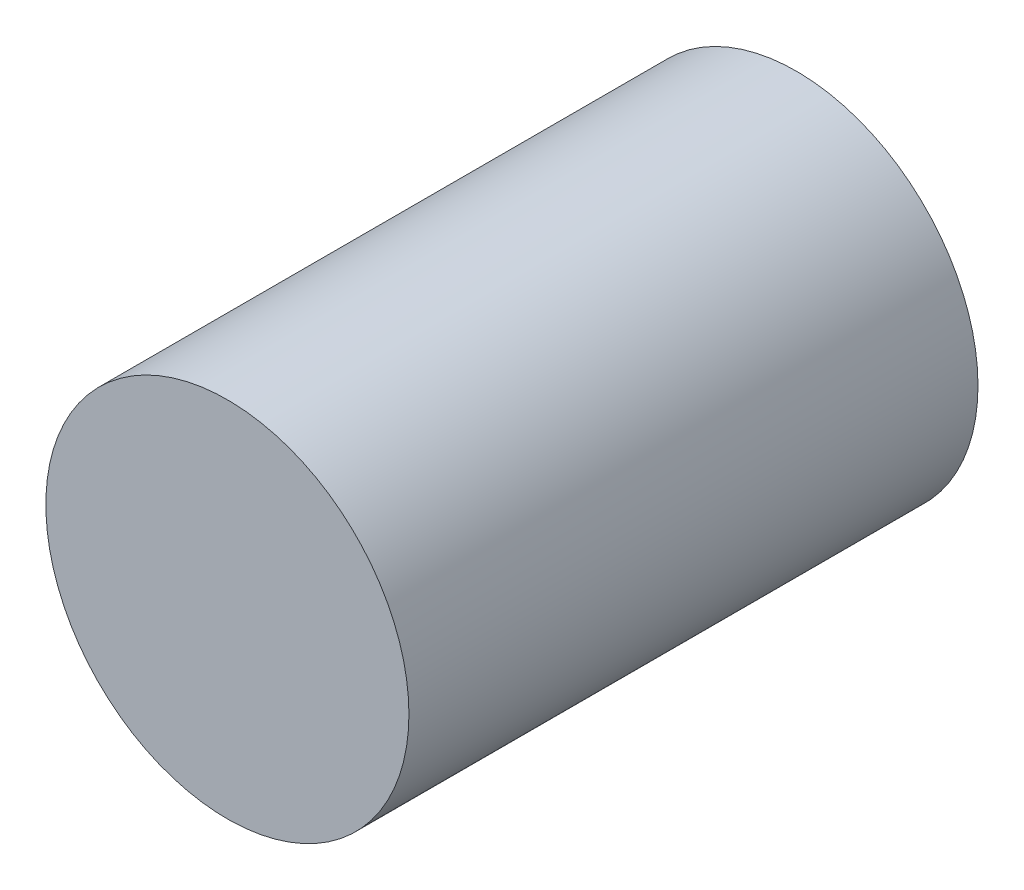
ISO-10303-21;
HEADER;
FILE_DESCRIPTION(('STEP AP214'),'2;1');
FILE_NAME('part.step','',(''),(''),'','','');
FILE_SCHEMA(('AUTOMOTIVE_DESIGN { 1 0 10303 214 1 1 1 1 }'));
ENDSEC;
DATA;
#1=APPLICATION_CONTEXT('core data for automotive mechanical design processes');
#2=APPLICATION_PROTOCOL_DEFINITION('international standard','automotive_design',2000,#1);
#3=PRODUCT_CONTEXT('',#1,'mechanical');
#4=PRODUCT('Part','Part','',(#3));
#5=PRODUCT_RELATED_PRODUCT_CATEGORY('part','',(#4));
#6=PRODUCT_DEFINITION_FORMATION('','',#4);
#7=PRODUCT_DEFINITION_CONTEXT('part definition',#1,'design');
#8=PRODUCT_DEFINITION('design','',#6,#7);
#9=PRODUCT_DEFINITION_SHAPE('','',#8);
#10=(LENGTH_UNIT() NAMED_UNIT(*) SI_UNIT(.MILLI.,.METRE.));
#11=(NAMED_UNIT(*) PLANE_ANGLE_UNIT() SI_UNIT($,.RADIAN.));
#12=(NAMED_UNIT(*) SI_UNIT($,.STERADIAN.) SOLID_ANGLE_UNIT());
#13=UNCERTAINTY_MEASURE_WITH_UNIT(LENGTH_MEASURE(1.E-05),#10,'distance_accuracy_value','');
#14=(GEOMETRIC_REPRESENTATION_CONTEXT(3) GLOBAL_UNCERTAINTY_ASSIGNED_CONTEXT((#13)) GLOBAL_UNIT_ASSIGNED_CONTEXT((#10,
#11,#12)) REPRESENTATION_CONTEXT('',''));
#15=CARTESIAN_POINT('',(0.,0.,0.));
#16=DIRECTION('',(0.,0.,1.));
#17=DIRECTION('',(1.,0.,0.));
#18=AXIS2_PLACEMENT_3D('',#15,#16,#17);
#19=CARTESIAN_POINT('',(0.,0.,-200.0001));
#20=DIRECTION('',(0.,0.,1.));
#21=DIRECTION('',(1.,0.,0.));
#22=AXIS2_PLACEMENT_3D('',#19,#20,#21);
#23=CYLINDRICAL_SURFACE('',#22,95.7093776508299);
#24=CARTESIAN_POINT('',(0.,0.,-200.0001));
#25=DIRECTION('',(0.,0.,1.));
#26=DIRECTION('',(1.,0.,0.));
#27=AXIS2_PLACEMENT_3D('',#24,#25,#26);
#28=CIRCLE('',#27,95.7093776508299);
#29=CARTESIAN_POINT('',(95.7093776508299,0.,-200.0001));
#30=VERTEX_POINT('',#29);
#31=EDGE_CURVE('E10',#30,#30,#28,.T.);
#32=ORIENTED_EDGE('',*,*,#31,.T.);
#33=EDGE_LOOP('',(#32));
#34=FACE_BOUND('',#33,.T.);
#35=CARTESIAN_POINT('',(0.,0.,100.));
#36=DIRECTION('',(0.,0.,1.));
#37=DIRECTION('',(1.,0.,0.));
#38=AXIS2_PLACEMENT_3D('',#35,#36,#37);
#39=CIRCLE('',#38,95.7093776508299);
#40=CARTESIAN_POINT('',(95.7093776508299,0.,100.));
#41=VERTEX_POINT('',#40);
#42=EDGE_CURVE('E40',#41,#41,#39,.T.);
#43=ORIENTED_EDGE('',*,*,#42,.F.);
#44=EDGE_LOOP('',(#43));
#45=FACE_BOUND('',#44,.T.);
#46=ADVANCED_FACE('F37',(#34,#45),#23,.T.);
#47=CARTESIAN_POINT('',(0.,0.,-200.0001));
#48=DIRECTION('',(0.,0.,1.));
#49=DIRECTION('',(1.,0.,0.));
#50=AXIS2_PLACEMENT_3D('',#47,#48,#49);
#51=PLANE('',#50);
#52=ORIENTED_EDGE('',*,*,#31,.F.);
#53=EDGE_LOOP('',(#52));
#54=FACE_BOUND('',#53,.T.);
#55=ADVANCED_FACE('F54',(#54),#51,.F.);
#56=CARTESIAN_POINT('',(0.,0.,100.));
#57=DIRECTION('',(0.,0.,1.));
#58=DIRECTION('',(1.,0.,0.));
#59=AXIS2_PLACEMENT_3D('',#56,#57,#58);
#60=PLANE('',#59);
#61=ORIENTED_EDGE('',*,*,#42,.T.);
#62=EDGE_LOOP('',(#61));
#63=FACE_BOUND('',#62,.T.);
#64=ADVANCED_FACE('F51',(#63),#60,.T.);
#65=CLOSED_SHELL('',(#46,#55,#64));
#66=MANIFOLD_SOLID_BREP('B2',#65);
#67=ADVANCED_BREP_SHAPE_REPRESENTATION('',(#18,#66),#14);
#68=SHAPE_DEFINITION_REPRESENTATION(#9,#67);
ENDSEC;
END-ISO-10303-21;
